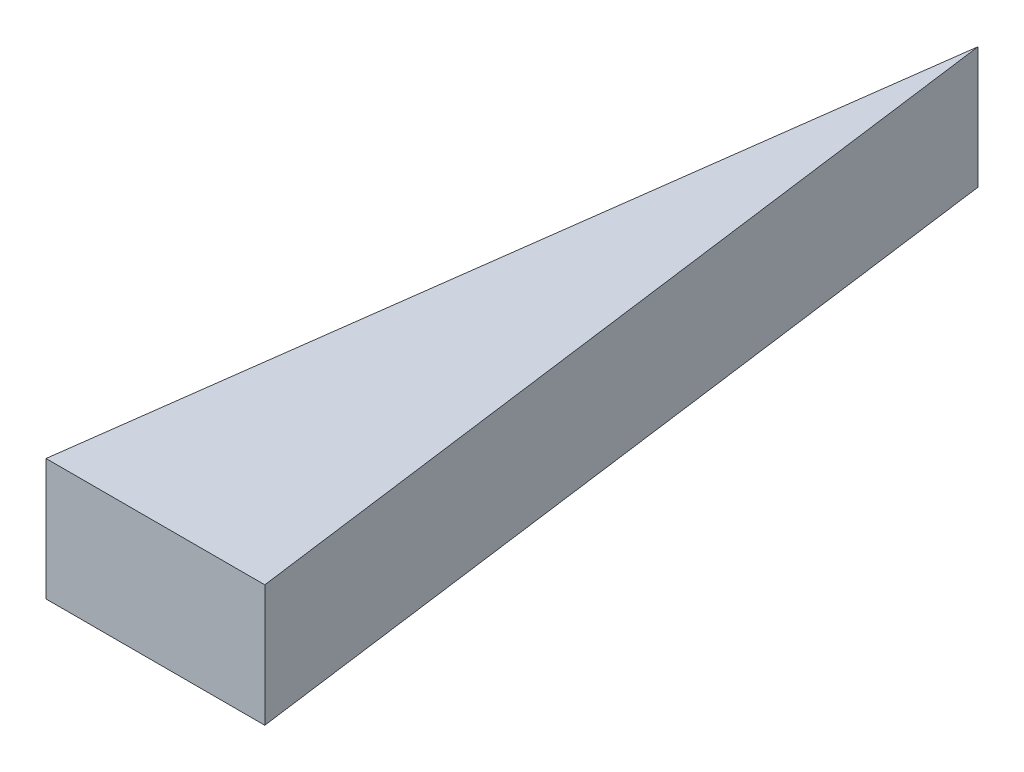
ISO-10303-21;
HEADER;
FILE_DESCRIPTION(('STEP AP214'),'2;1');
FILE_NAME('part.step','',(''),(''),'','','');
FILE_SCHEMA(('AUTOMOTIVE_DESIGN { 1 0 10303 214 1 1 1 1 }'));
ENDSEC;
DATA;
#1=APPLICATION_CONTEXT('core data for automotive mechanical design processes');
#2=APPLICATION_PROTOCOL_DEFINITION('international standard','automotive_design',2000,#1);
#3=PRODUCT_CONTEXT('',#1,'mechanical');
#4=PRODUCT('Part','Part','',(#3));
#5=PRODUCT_RELATED_PRODUCT_CATEGORY('part','',(#4));
#6=PRODUCT_DEFINITION_FORMATION('','',#4);
#7=PRODUCT_DEFINITION_CONTEXT('part definition',#1,'design');
#8=PRODUCT_DEFINITION('design','',#6,#7);
#9=PRODUCT_DEFINITION_SHAPE('','',#8);
#10=(LENGTH_UNIT() NAMED_UNIT(*) SI_UNIT(.MILLI.,.METRE.));
#11=(NAMED_UNIT(*) PLANE_ANGLE_UNIT() SI_UNIT($,.RADIAN.));
#12=(NAMED_UNIT(*) SI_UNIT($,.STERADIAN.) SOLID_ANGLE_UNIT());
#13=UNCERTAINTY_MEASURE_WITH_UNIT(LENGTH_MEASURE(1.E-05),#10,'distance_accuracy_value','');
#14=(GEOMETRIC_REPRESENTATION_CONTEXT(3) GLOBAL_UNCERTAINTY_ASSIGNED_CONTEXT((#13)) GLOBAL_UNIT_ASSIGNED_CONTEXT((#10,
#11,#12)) REPRESENTATION_CONTEXT('',''));
#15=CARTESIAN_POINT('',(0.,0.,0.));
#16=DIRECTION('',(0.,0.,1.));
#17=DIRECTION('',(1.,0.,0.));
#18=AXIS2_PLACEMENT_3D('',#15,#16,#17);
#19=CARTESIAN_POINT('',(0.,-65.09,0.));
#20=DIRECTION('',(0.,-1.,0.));
#21=DIRECTION('',(0.,0.,-1.));
#22=AXIS2_PLACEMENT_3D('',#19,#20,#21);
#23=PLANE('',#22);
#24=DIRECTION('',(-0.13182166265006,0.,-0.991273448275588));
#25=VECTOR('',#24,1.);
#26=CARTESIAN_POINT('',(117.055,-65.09,880.230996599756));
#27=LINE('',#26,#25);
#28=CARTESIAN_POINT('',(117.055,-65.09,880.230996599756));
#29=VERTEX_POINT('',#28);
#30=CARTESIAN_POINT('',(0.,-65.09,0.));
#31=VERTEX_POINT('',#30);
#32=EDGE_CURVE('E116',#29,#31,#27,.T.);
#33=ORIENTED_EDGE('',*,*,#32,.F.);
#34=DIRECTION('',(1.,0.,0.));
#35=VECTOR('',#34,1.);
#36=CARTESIAN_POINT('',(-117.055,-65.09,880.230996599756));
#37=LINE('',#36,#35);
#38=CARTESIAN_POINT('',(-117.055,-65.09,880.230996599756));
#39=VERTEX_POINT('',#38);
#40=EDGE_CURVE('E74',#39,#29,#37,.T.);
#41=ORIENTED_EDGE('',*,*,#40,.F.);
#42=DIRECTION('',(-0.13182166265006,0.,0.991273448275588));
#43=VECTOR('',#42,1.);
#44=CARTESIAN_POINT('',(0.,-65.09,0.));
#45=LINE('',#44,#43);
#46=EDGE_CURVE('E120',#31,#39,#45,.T.);
#47=ORIENTED_EDGE('',*,*,#46,.F.);
#48=EDGE_LOOP('',(#33,#41,#47));
#49=FACE_BOUND('',#48,.T.);
#50=DIRECTION('',(1.,0.,0.));
#51=VECTOR('',#50,1.);
#52=CARTESIAN_POINT('',(0.,-65.09,875.230996599756));
#53=LINE('',#52,#51);
#54=CARTESIAN_POINT('',(-111.346072435063,-65.09,875.230996599756));
#55=VERTEX_POINT('',#54);
#56=CARTESIAN_POINT('',(111.346072435063,-65.09,875.230996599756));
#57=VERTEX_POINT('',#56);
#58=EDGE_CURVE('E48',#55,#57,#53,.T.);
#59=ORIENTED_EDGE('',*,*,#58,.T.);
#60=DIRECTION('',(-0.13182166265006,0.,-0.991273448275587));
#61=VECTOR('',#60,1.);
#62=CARTESIAN_POINT('',(-4.95636724137794,-65.09,0.659108313250299));
#63=LINE('',#62,#61);
#64=CARTESIAN_POINT('',(0.,-65.09,37.9300328905216));
#65=VERTEX_POINT('',#64);
#66=EDGE_CURVE('E126',#57,#65,#63,.T.);
#67=ORIENTED_EDGE('',*,*,#66,.T.);
#68=DIRECTION('',(-0.13182166265006,0.,0.991273448275587));
#69=VECTOR('',#68,1.);
#70=CARTESIAN_POINT('',(4.95636724137794,-65.09,0.659108313250299));
#71=LINE('',#70,#69);
#72=EDGE_CURVE('E115',#65,#55,#71,.T.);
#73=ORIENTED_EDGE('',*,*,#72,.T.);
#74=EDGE_LOOP('',(#59,#67,#73));
#75=FACE_BOUND('',#74,.T.);
#76=ADVANCED_FACE('F33',(#49,#75),#23,.T.);
#77=CARTESIAN_POINT('',(117.055,65.09,880.230996599756));
#78=DIRECTION('',(-0.991273448275587,0.,0.13182166265006));
#79=DIRECTION('',(0.13182166265006,0.,0.991273448275587));
#80=AXIS2_PLACEMENT_3D('',#77,#78,#79);
#81=PLANE('',#80);
#82=ORIENTED_EDGE('',*,*,#32,.T.);
#83=DIRECTION('',(0.,-1.,0.));
#84=VECTOR('',#83,1.);
#85=CARTESIAN_POINT('',(0.,65.09,0.));
#86=LINE('',#85,#84);
#87=CARTESIAN_POINT('',(0.,65.09,0.));
#88=VERTEX_POINT('',#87);
#89=EDGE_CURVE('E11',#88,#31,#86,.T.);
#90=ORIENTED_EDGE('',*,*,#89,.F.);
#91=DIRECTION('',(-0.13182166265006,0.,-0.991273448275588));
#92=VECTOR('',#91,1.);
#93=CARTESIAN_POINT('',(117.055,65.09,880.230996599756));
#94=LINE('',#93,#92);
#95=CARTESIAN_POINT('',(117.055,65.09,880.230996599756));
#96=VERTEX_POINT('',#95);
#97=EDGE_CURVE('E130',#96,#88,#94,.T.);
#98=ORIENTED_EDGE('',*,*,#97,.F.);
#99=DIRECTION('',(0.,-1.,0.));
#100=VECTOR('',#99,1.);
#101=CARTESIAN_POINT('',(117.055,65.09,880.230996599756));
#102=LINE('',#101,#100);
#103=EDGE_CURVE('E133',#96,#29,#102,.T.);
#104=ORIENTED_EDGE('',*,*,#103,.T.);
#105=EDGE_LOOP('',(#82,#90,#98,#104));
#106=FACE_BOUND('',#105,.T.);
#107=ADVANCED_FACE('F35',(#106),#81,.F.);
#108=CARTESIAN_POINT('',(0.,65.09,0.));
#109=DIRECTION('',(0.991273448275587,0.,0.13182166265006));
#110=DIRECTION('',(0.13182166265006,0.,-0.991273448275587));
#111=AXIS2_PLACEMENT_3D('',#108,#109,#110);
#112=PLANE('',#111);
#113=ORIENTED_EDGE('',*,*,#46,.T.);
#114=DIRECTION('',(0.,-1.,0.));
#115=VECTOR('',#114,1.);
#116=CARTESIAN_POINT('',(-117.055,65.09,880.230996599756));
#117=LINE('',#116,#115);
#118=CARTESIAN_POINT('',(-117.055,65.09,880.230996599756));
#119=VERTEX_POINT('',#118);
#120=EDGE_CURVE('E41',#119,#39,#117,.T.);
#121=ORIENTED_EDGE('',*,*,#120,.F.);
#122=DIRECTION('',(-0.13182166265006,0.,0.991273448275588));
#123=VECTOR('',#122,1.);
#124=CARTESIAN_POINT('',(0.,65.09,0.));
#125=LINE('',#124,#123);
#126=EDGE_CURVE('E79',#88,#119,#125,.T.);
#127=ORIENTED_EDGE('',*,*,#126,.F.);
#128=ORIENTED_EDGE('',*,*,#89,.T.);
#129=EDGE_LOOP('',(#113,#121,#127,#128));
#130=FACE_BOUND('',#129,.T.);
#131=ADVANCED_FACE('F152',(#130),#112,.F.);
#132=CARTESIAN_POINT('',(-117.055,65.09,880.230996599756));
#133=DIRECTION('',(0.,0.,-1.));
#134=DIRECTION('',(-1.,0.,0.));
#135=AXIS2_PLACEMENT_3D('',#132,#133,#134);
#136=PLANE('',#135);
#137=ORIENTED_EDGE('',*,*,#40,.T.);
#138=ORIENTED_EDGE('',*,*,#103,.F.);
#139=DIRECTION('',(1.,0.,0.));
#140=VECTOR('',#139,1.);
#141=CARTESIAN_POINT('',(-117.055,65.09,880.230996599756));
#142=LINE('',#141,#140);
#143=EDGE_CURVE('E57',#119,#96,#142,.T.);
#144=ORIENTED_EDGE('',*,*,#143,.F.);
#145=ORIENTED_EDGE('',*,*,#120,.T.);
#146=EDGE_LOOP('',(#137,#138,#144,#145));
#147=FACE_BOUND('',#146,.T.);
#148=ADVANCED_FACE('F137',(#147),#136,.F.);
#149=CARTESIAN_POINT('',(0.,65.09,0.));
#150=DIRECTION('',(0.,-1.,0.));
#151=DIRECTION('',(0.,0.,-1.));
#152=AXIS2_PLACEMENT_3D('',#149,#150,#151);
#153=PLANE('',#152);
#154=ORIENTED_EDGE('',*,*,#97,.T.);
#155=ORIENTED_EDGE('',*,*,#126,.T.);
#156=ORIENTED_EDGE('',*,*,#143,.T.);
#157=EDGE_LOOP('',(#154,#155,#156));
#158=FACE_BOUND('',#157,.T.);
#159=ADVANCED_FACE('F144',(#158),#153,.F.);
#160=CARTESIAN_POINT('',(112.098632758622,65.09,880.890104913006));
#161=DIRECTION('',(-0.991273448275587,0.,0.13182166265006));
#162=DIRECTION('',(0.13182166265006,0.,0.991273448275587));
#163=AXIS2_PLACEMENT_3D('',#160,#161,#162);
#164=PLANE('',#163);
#165=ORIENTED_EDGE('',*,*,#66,.F.);
#166=DIRECTION('',(0.,-1.,0.));
#167=VECTOR('',#166,1.);
#168=CARTESIAN_POINT('',(111.346072435063,65.09,875.230996599756));
#169=LINE('',#168,#167);
#170=CARTESIAN_POINT('',(111.346072435063,60.09,875.230996599756));
#171=VERTEX_POINT('',#170);
#172=EDGE_CURVE('E111',#171,#57,#169,.T.);
#173=ORIENTED_EDGE('',*,*,#172,.F.);
#174=DIRECTION('',(-0.13182166265006,0.,-0.991273448275587));
#175=VECTOR('',#174,1.);
#176=CARTESIAN_POINT('',(-4.95636724137794,60.09,0.659108313250299));
#177=LINE('',#176,#175);
#178=CARTESIAN_POINT('',(0.,60.09,37.9300328905216));
#179=VERTEX_POINT('',#178);
#180=EDGE_CURVE('E99',#171,#179,#177,.T.);
#181=ORIENTED_EDGE('',*,*,#180,.T.);
#182=DIRECTION('',(0.,-1.,0.));
#183=VECTOR('',#182,1.);
#184=CARTESIAN_POINT('',(0.,65.09,37.9300328905216));
#185=LINE('',#184,#183);
#186=EDGE_CURVE('E109',#179,#65,#185,.T.);
#187=ORIENTED_EDGE('',*,*,#186,.T.);
#188=EDGE_LOOP('',(#165,#173,#181,#187));
#189=FACE_BOUND('',#188,.T.);
#190=ADVANCED_FACE('F108',(#189),#164,.T.);
#191=CARTESIAN_POINT('',(4.95636724137794,65.09,0.659108313250299));
#192=DIRECTION('',(0.991273448275587,0.,0.13182166265006));
#193=DIRECTION('',(0.13182166265006,0.,-0.991273448275587));
#194=AXIS2_PLACEMENT_3D('',#191,#192,#193);
#195=PLANE('',#194);
#196=ORIENTED_EDGE('',*,*,#72,.F.);
#197=ORIENTED_EDGE('',*,*,#186,.F.);
#198=DIRECTION('',(-0.13182166265006,0.,0.991273448275587));
#199=VECTOR('',#198,1.);
#200=CARTESIAN_POINT('',(4.95636724137794,60.09,0.659108313250299));
#201=LINE('',#200,#199);
#202=CARTESIAN_POINT('',(-111.346072435063,60.09,875.230996599756));
#203=VERTEX_POINT('',#202);
#204=EDGE_CURVE('E96',#179,#203,#201,.T.);
#205=ORIENTED_EDGE('',*,*,#204,.T.);
#206=DIRECTION('',(0.,-1.,0.));
#207=VECTOR('',#206,1.);
#208=CARTESIAN_POINT('',(-111.346072435063,65.09,875.230996599756));
#209=LINE('',#208,#207);
#210=EDGE_CURVE('E117',#203,#55,#209,.T.);
#211=ORIENTED_EDGE('',*,*,#210,.T.);
#212=EDGE_LOOP('',(#196,#197,#205,#211));
#213=FACE_BOUND('',#212,.T.);
#214=ADVANCED_FACE('F113',(#213),#195,.T.);
#215=CARTESIAN_POINT('',(-117.055,65.09,875.230996599756));
#216=DIRECTION('',(0.,0.,-1.));
#217=DIRECTION('',(-1.,0.,0.));
#218=AXIS2_PLACEMENT_3D('',#215,#216,#217);
#219=PLANE('',#218);
#220=ORIENTED_EDGE('',*,*,#58,.F.);
#221=ORIENTED_EDGE('',*,*,#210,.F.);
#222=DIRECTION('',(1.,0.,0.));
#223=VECTOR('',#222,1.);
#224=CARTESIAN_POINT('',(0.,60.09,875.230996599756));
#225=LINE('',#224,#223);
#226=EDGE_CURVE('E100',#203,#171,#225,.T.);
#227=ORIENTED_EDGE('',*,*,#226,.T.);
#228=ORIENTED_EDGE('',*,*,#172,.T.);
#229=EDGE_LOOP('',(#220,#221,#227,#228));
#230=FACE_BOUND('',#229,.T.);
#231=ADVANCED_FACE('F192',(#230),#219,.T.);
#232=CARTESIAN_POINT('',(0.,60.09,0.));
#233=DIRECTION('',(0.,-1.,0.));
#234=DIRECTION('',(0.,0.,-1.));
#235=AXIS2_PLACEMENT_3D('',#232,#233,#234);
#236=PLANE('',#235);
#237=ORIENTED_EDGE('',*,*,#180,.F.);
#238=ORIENTED_EDGE('',*,*,#226,.F.);
#239=ORIENTED_EDGE('',*,*,#204,.F.);
#240=EDGE_LOOP('',(#237,#238,#239));
#241=FACE_BOUND('',#240,.T.);
#242=ADVANCED_FACE('F98',(#241),#236,.T.);
#243=CLOSED_SHELL('',(#76,#107,#131,#148,#159,#190,#214,#231,#242));
#244=MANIFOLD_SOLID_BREP('B2',#243);
#245=ADVANCED_BREP_SHAPE_REPRESENTATION('',(#18,#244),#14);
#246=SHAPE_DEFINITION_REPRESENTATION(#9,#245);
ENDSEC;
END-ISO-10303-21;
